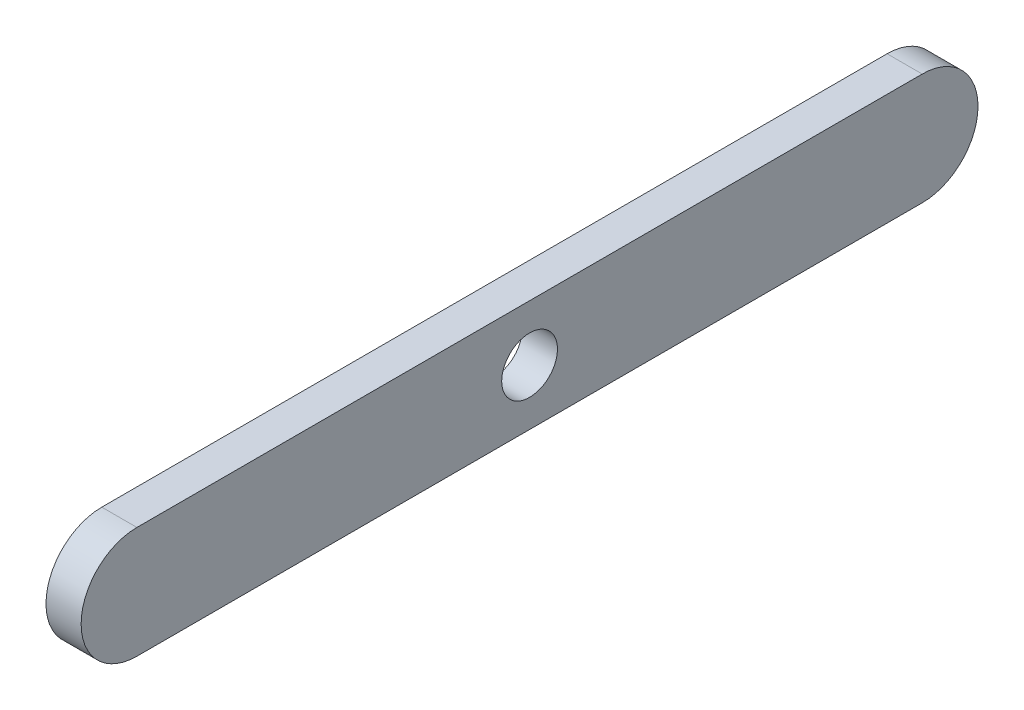
ISO-10303-21;
HEADER;
FILE_DESCRIPTION(('STEP AP214'),'2;1');
FILE_NAME('part.step','',(''),(''),'','','');
FILE_SCHEMA(('AUTOMOTIVE_DESIGN { 1 0 10303 214 1 1 1 1 }'));
ENDSEC;
DATA;
#1=APPLICATION_CONTEXT('core data for automotive mechanical design processes');
#2=APPLICATION_PROTOCOL_DEFINITION('international standard','automotive_design',2000,#1);
#3=PRODUCT_CONTEXT('',#1,'mechanical');
#4=PRODUCT('Part','Part','',(#3));
#5=PRODUCT_RELATED_PRODUCT_CATEGORY('part','',(#4));
#6=PRODUCT_DEFINITION_FORMATION('','',#4);
#7=PRODUCT_DEFINITION_CONTEXT('part definition',#1,'design');
#8=PRODUCT_DEFINITION('design','',#6,#7);
#9=PRODUCT_DEFINITION_SHAPE('','',#8);
#10=(LENGTH_UNIT() NAMED_UNIT(*) SI_UNIT(.MILLI.,.METRE.));
#11=(NAMED_UNIT(*) PLANE_ANGLE_UNIT() SI_UNIT($,.RADIAN.));
#12=(NAMED_UNIT(*) SI_UNIT($,.STERADIAN.) SOLID_ANGLE_UNIT());
#13=UNCERTAINTY_MEASURE_WITH_UNIT(LENGTH_MEASURE(1.E-05),#10,'distance_accuracy_value','');
#14=(GEOMETRIC_REPRESENTATION_CONTEXT(3) GLOBAL_UNCERTAINTY_ASSIGNED_CONTEXT((#13)) GLOBAL_UNIT_ASSIGNED_CONTEXT((#10,
#11,#12)) REPRESENTATION_CONTEXT('',''));
#15=CARTESIAN_POINT('',(0.,0.,0.));
#16=DIRECTION('',(0.,0.,1.));
#17=DIRECTION('',(1.,0.,0.));
#18=AXIS2_PLACEMENT_3D('',#15,#16,#17);
#19=CARTESIAN_POINT('',(2.,3.175,11.175));
#20=DIRECTION('',(1.,0.,0.));
#21=DIRECTION('',(0.,0.,-1.));
#22=AXIS2_PLACEMENT_3D('',#19,#20,#21);
#23=PLANE('',#22);
#24=CARTESIAN_POINT('',(2.,3.175,11.175));
#25=DIRECTION('',(1.,0.,0.));
#26=DIRECTION('',(0.,0.,-1.));
#27=AXIS2_PLACEMENT_3D('',#24,#25,#26);
#28=CIRCLE('',#27,3.175);
#29=CARTESIAN_POINT('',(2.,6.35,11.175));
#30=VERTEX_POINT('',#29);
#31=CARTESIAN_POINT('',(2.,0.,11.175));
#32=VERTEX_POINT('',#31);
#33=EDGE_CURVE('E85',#30,#32,#28,.T.);
#34=ORIENTED_EDGE('',*,*,#33,.T.);
#35=DIRECTION('',(0.,0.,-1.));
#36=VECTOR('',#35,1.);
#37=CARTESIAN_POINT('',(2.,0.,-33.525));
#38=LINE('',#37,#36);
#39=CARTESIAN_POINT('',(2.,0.,-33.525));
#40=VERTEX_POINT('',#39);
#41=EDGE_CURVE('E80',#32,#40,#38,.T.);
#42=ORIENTED_EDGE('',*,*,#41,.T.);
#43=CARTESIAN_POINT('',(2.,3.175,-33.525));
#44=DIRECTION('',(1.,0.,0.));
#45=DIRECTION('',(0.,0.,1.));
#46=AXIS2_PLACEMENT_3D('',#43,#44,#45);
#47=CIRCLE('',#46,3.175);
#48=CARTESIAN_POINT('',(2.,6.35,-33.525));
#49=VERTEX_POINT('',#48);
#50=EDGE_CURVE('E83',#40,#49,#47,.T.);
#51=ORIENTED_EDGE('',*,*,#50,.T.);
#52=DIRECTION('',(0.,0.,1.));
#53=VECTOR('',#52,1.);
#54=CARTESIAN_POINT('',(2.,6.35,-33.525));
#55=LINE('',#54,#53);
#56=EDGE_CURVE('E50',#49,#30,#55,.T.);
#57=ORIENTED_EDGE('',*,*,#56,.T.);
#58=EDGE_LOOP('',(#34,#42,#51,#57));
#59=FACE_BOUND('',#58,.T.);
#60=CARTESIAN_POINT('',(2.,3.175,-11.175));
#61=DIRECTION('',(1.,0.,0.));
#62=DIRECTION('',(0.,0.,1.));
#63=AXIS2_PLACEMENT_3D('',#60,#61,#62);
#64=CIRCLE('',#63,1.5875);
#65=CARTESIAN_POINT('',(2.,3.175,-9.5875));
#66=VERTEX_POINT('',#65);
#67=EDGE_CURVE('E100',#66,#66,#64,.T.);
#68=ORIENTED_EDGE('',*,*,#67,.F.);
#69=EDGE_LOOP('',(#68));
#70=FACE_BOUND('',#69,.T.);
#71=ADVANCED_FACE('F33',(#59,#70),#23,.T.);
#72=CARTESIAN_POINT('',(0.,3.175,11.175));
#73=DIRECTION('',(1.,0.,0.));
#74=DIRECTION('',(0.,0.,-1.));
#75=AXIS2_PLACEMENT_3D('',#72,#73,#74);
#76=PLANE('',#75);
#77=CARTESIAN_POINT('',(0.,3.175,11.175));
#78=DIRECTION('',(1.,0.,0.));
#79=DIRECTION('',(0.,0.,-1.));
#80=AXIS2_PLACEMENT_3D('',#77,#78,#79);
#81=CIRCLE('',#80,3.175);
#82=CARTESIAN_POINT('',(0.,6.35,11.175));
#83=VERTEX_POINT('',#82);
#84=CARTESIAN_POINT('',(0.,0.,11.175));
#85=VERTEX_POINT('',#84);
#86=EDGE_CURVE('E97',#83,#85,#81,.T.);
#87=ORIENTED_EDGE('',*,*,#86,.F.);
#88=DIRECTION('',(0.,0.,1.));
#89=VECTOR('',#88,1.);
#90=CARTESIAN_POINT('',(0.,6.35,-33.525));
#91=LINE('',#90,#89);
#92=CARTESIAN_POINT('',(0.,6.35,-33.525));
#93=VERTEX_POINT('',#92);
#94=EDGE_CURVE('E73',#93,#83,#91,.T.);
#95=ORIENTED_EDGE('',*,*,#94,.F.);
#96=CARTESIAN_POINT('',(0.,3.175,-33.525));
#97=DIRECTION('',(1.,0.,0.));
#98=DIRECTION('',(0.,0.,1.));
#99=AXIS2_PLACEMENT_3D('',#96,#97,#98);
#100=CIRCLE('',#99,3.175);
#101=CARTESIAN_POINT('',(0.,0.,-33.525));
#102=VERTEX_POINT('',#101);
#103=EDGE_CURVE('E67',#102,#93,#100,.T.);
#104=ORIENTED_EDGE('',*,*,#103,.F.);
#105=DIRECTION('',(0.,0.,-1.));
#106=VECTOR('',#105,1.);
#107=CARTESIAN_POINT('',(0.,0.,-33.525));
#108=LINE('',#107,#106);
#109=EDGE_CURVE('E89',#85,#102,#108,.T.);
#110=ORIENTED_EDGE('',*,*,#109,.F.);
#111=EDGE_LOOP('',(#87,#95,#104,#110));
#112=FACE_BOUND('',#111,.T.);
#113=CARTESIAN_POINT('',(0.,3.175,-11.175));
#114=DIRECTION('',(1.,0.,0.));
#115=DIRECTION('',(0.,0.,1.));
#116=AXIS2_PLACEMENT_3D('',#113,#114,#115);
#117=CIRCLE('',#116,1.5875);
#118=CARTESIAN_POINT('',(0.,3.175,-9.5875));
#119=VERTEX_POINT('',#118);
#120=EDGE_CURVE('E112',#119,#119,#117,.T.);
#121=ORIENTED_EDGE('',*,*,#120,.T.);
#122=EDGE_LOOP('',(#121));
#123=FACE_BOUND('',#122,.T.);
#124=ADVANCED_FACE('F108',(#112,#123),#76,.F.);
#125=CARTESIAN_POINT('',(2.,3.175,11.175));
#126=DIRECTION('',(-1.,0.,0.));
#127=DIRECTION('',(0.,0.,1.));
#128=AXIS2_PLACEMENT_3D('',#125,#126,#127);
#129=CYLINDRICAL_SURFACE('',#128,3.175);
#130=ORIENTED_EDGE('',*,*,#86,.T.);
#131=DIRECTION('',(-1.,0.,0.));
#132=VECTOR('',#131,1.);
#133=CARTESIAN_POINT('',(2.,0.,11.175));
#134=LINE('',#133,#132);
#135=EDGE_CURVE('E11',#32,#85,#134,.T.);
#136=ORIENTED_EDGE('',*,*,#135,.F.);
#137=ORIENTED_EDGE('',*,*,#33,.F.);
#138=DIRECTION('',(-1.,0.,0.));
#139=VECTOR('',#138,1.);
#140=CARTESIAN_POINT('',(2.,6.35,11.175));
#141=LINE('',#140,#139);
#142=EDGE_CURVE('E93',#30,#83,#141,.T.);
#143=ORIENTED_EDGE('',*,*,#142,.T.);
#144=EDGE_LOOP('',(#130,#136,#137,#143));
#145=FACE_BOUND('',#144,.T.);
#146=ADVANCED_FACE('F35',(#145),#129,.T.);
#147=CARTESIAN_POINT('',(2.,0.,-33.525));
#148=DIRECTION('',(0.,1.,0.));
#149=DIRECTION('',(0.,0.,1.));
#150=AXIS2_PLACEMENT_3D('',#147,#148,#149);
#151=PLANE('',#150);
#152=ORIENTED_EDGE('',*,*,#109,.T.);
#153=DIRECTION('',(-1.,0.,0.));
#154=VECTOR('',#153,1.);
#155=CARTESIAN_POINT('',(2.,0.,-33.525));
#156=LINE('',#155,#154);
#157=EDGE_CURVE('E42',#40,#102,#156,.T.);
#158=ORIENTED_EDGE('',*,*,#157,.F.);
#159=ORIENTED_EDGE('',*,*,#41,.F.);
#160=ORIENTED_EDGE('',*,*,#135,.T.);
#161=EDGE_LOOP('',(#152,#158,#159,#160));
#162=FACE_BOUND('',#161,.T.);
#163=ADVANCED_FACE('F88',(#162),#151,.F.);
#164=CARTESIAN_POINT('',(2.,3.175,-33.525));
#165=DIRECTION('',(-1.,0.,0.));
#166=DIRECTION('',(0.,0.,1.));
#167=AXIS2_PLACEMENT_3D('',#164,#165,#166);
#168=CYLINDRICAL_SURFACE('',#167,3.175);
#169=ORIENTED_EDGE('',*,*,#103,.T.);
#170=DIRECTION('',(-1.,0.,0.));
#171=VECTOR('',#170,1.);
#172=CARTESIAN_POINT('',(2.,6.35,-33.525));
#173=LINE('',#172,#171);
#174=EDGE_CURVE('E90',#49,#93,#173,.T.);
#175=ORIENTED_EDGE('',*,*,#174,.F.);
#176=ORIENTED_EDGE('',*,*,#50,.F.);
#177=ORIENTED_EDGE('',*,*,#157,.T.);
#178=EDGE_LOOP('',(#169,#175,#176,#177));
#179=FACE_BOUND('',#178,.T.);
#180=ADVANCED_FACE('F91',(#179),#168,.T.);
#181=CARTESIAN_POINT('',(2.,6.35,-33.525));
#182=DIRECTION('',(0.,-1.,0.));
#183=DIRECTION('',(0.,0.,-1.));
#184=AXIS2_PLACEMENT_3D('',#181,#182,#183);
#185=PLANE('',#184);
#186=ORIENTED_EDGE('',*,*,#94,.T.);
#187=ORIENTED_EDGE('',*,*,#142,.F.);
#188=ORIENTED_EDGE('',*,*,#56,.F.);
#189=ORIENTED_EDGE('',*,*,#174,.T.);
#190=EDGE_LOOP('',(#186,#187,#188,#189));
#191=FACE_BOUND('',#190,.T.);
#192=ADVANCED_FACE('F105',(#191),#185,.F.);
#193=CARTESIAN_POINT('',(2.,3.175,-11.175));
#194=DIRECTION('',(-1.,0.,0.));
#195=DIRECTION('',(0.,0.,1.));
#196=AXIS2_PLACEMENT_3D('',#193,#194,#195);
#197=CYLINDRICAL_SURFACE('',#196,1.5875);
#198=ORIENTED_EDGE('',*,*,#67,.T.);
#199=EDGE_LOOP('',(#198));
#200=FACE_BOUND('',#199,.T.);
#201=ORIENTED_EDGE('',*,*,#120,.F.);
#202=EDGE_LOOP('',(#201));
#203=FACE_BOUND('',#202,.T.);
#204=ADVANCED_FACE('F118',(#200,#203),#197,.F.);
#205=CLOSED_SHELL('',(#71,#124,#146,#163,#180,#192,#204));
#206=MANIFOLD_SOLID_BREP('B2',#205);
#207=ADVANCED_BREP_SHAPE_REPRESENTATION('',(#18,#206),#14);
#208=SHAPE_DEFINITION_REPRESENTATION(#9,#207);
ENDSEC;
END-ISO-10303-21;
